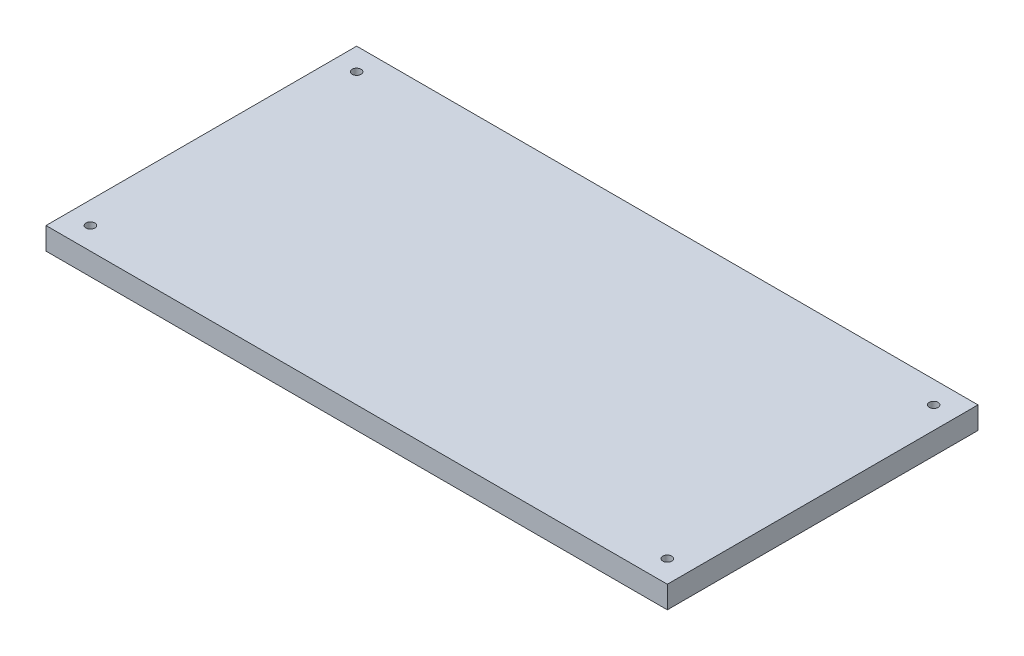
ISO-10303-21;
HEADER;
FILE_DESCRIPTION(('STEP AP214'),'2;1');
FILE_NAME('part.step','',(''),(''),'','','');
FILE_SCHEMA(('AUTOMOTIVE_DESIGN { 1 0 10303 214 1 1 1 1 }'));
ENDSEC;
DATA;
#1=APPLICATION_CONTEXT('core data for automotive mechanical design processes');
#2=APPLICATION_PROTOCOL_DEFINITION('international standard','automotive_design',2000,#1);
#3=PRODUCT_CONTEXT('',#1,'mechanical');
#4=PRODUCT('Part','Part','',(#3));
#5=PRODUCT_RELATED_PRODUCT_CATEGORY('part','',(#4));
#6=PRODUCT_DEFINITION_FORMATION('','',#4);
#7=PRODUCT_DEFINITION_CONTEXT('part definition',#1,'design');
#8=PRODUCT_DEFINITION('design','',#6,#7);
#9=PRODUCT_DEFINITION_SHAPE('','',#8);
#10=(LENGTH_UNIT() NAMED_UNIT(*) SI_UNIT(.MILLI.,.METRE.));
#11=(NAMED_UNIT(*) PLANE_ANGLE_UNIT() SI_UNIT($,.RADIAN.));
#12=(NAMED_UNIT(*) SI_UNIT($,.STERADIAN.) SOLID_ANGLE_UNIT());
#13=UNCERTAINTY_MEASURE_WITH_UNIT(LENGTH_MEASURE(1.E-05),#10,'distance_accuracy_value','');
#14=(GEOMETRIC_REPRESENTATION_CONTEXT(3) GLOBAL_UNCERTAINTY_ASSIGNED_CONTEXT((#13)) GLOBAL_UNIT_ASSIGNED_CONTEXT((#10,
#11,#12)) REPRESENTATION_CONTEXT('',''));
#15=CARTESIAN_POINT('',(0.,0.,0.));
#16=DIRECTION('',(0.,0.,1.));
#17=DIRECTION('',(1.,0.,0.));
#18=AXIS2_PLACEMENT_3D('',#15,#16,#17);
#19=CARTESIAN_POINT('',(0.,5.,0.));
#20=DIRECTION('',(0.,1.,0.));
#21=DIRECTION('',(0.,0.,1.));
#22=AXIS2_PLACEMENT_3D('',#19,#20,#21);
#23=PLANE('',#22);
#24=CARTESIAN_POINT('',(5.,5.,5.00000000000003));
#25=DIRECTION('',(0.,1.,0.));
#26=DIRECTION('',(0.,0.,1.));
#27=AXIS2_PLACEMENT_3D('',#24,#25,#26);
#28=CIRCLE('',#27,0.999999999999998);
#29=CARTESIAN_POINT('',(5.,5.,6.00000000000003));
#30=VERTEX_POINT('',#29);
#31=EDGE_CURVE('E148',#30,#30,#28,.T.);
#32=ORIENTED_EDGE('',*,*,#31,.F.);
#33=EDGE_LOOP('',(#32));
#34=FACE_BOUND('',#33,.T.);
#35=CARTESIAN_POINT('',(135.,5.,65.));
#36=DIRECTION('',(0.,1.,0.));
#37=DIRECTION('',(0.,0.,1.));
#38=AXIS2_PLACEMENT_3D('',#35,#36,#37);
#39=CIRCLE('',#38,0.999999999999998);
#40=CARTESIAN_POINT('',(135.,5.,66.));
#41=VERTEX_POINT('',#40);
#42=EDGE_CURVE('E118',#41,#41,#39,.T.);
#43=ORIENTED_EDGE('',*,*,#42,.F.);
#44=EDGE_LOOP('',(#43));
#45=FACE_BOUND('',#44,.T.);
#46=DIRECTION('',(0.,0.,1.));
#47=VECTOR('',#46,1.);
#48=CARTESIAN_POINT('',(0.,5.,0.));
#49=LINE('',#48,#47);
#50=CARTESIAN_POINT('',(0.,5.,0.));
#51=VERTEX_POINT('',#50);
#52=CARTESIAN_POINT('',(0.,5.,70.));
#53=VERTEX_POINT('',#52);
#54=EDGE_CURVE('E98',#51,#53,#49,.T.);
#55=ORIENTED_EDGE('',*,*,#54,.T.);
#56=DIRECTION('',(1.,0.,0.));
#57=VECTOR('',#56,1.);
#58=CARTESIAN_POINT('',(0.,5.,70.));
#59=LINE('',#58,#57);
#60=CARTESIAN_POINT('',(140.,5.,70.));
#61=VERTEX_POINT('',#60);
#62=EDGE_CURVE('E93',#53,#61,#59,.T.);
#63=ORIENTED_EDGE('',*,*,#62,.T.);
#64=DIRECTION('',(0.,0.,-1.));
#65=VECTOR('',#64,1.);
#66=CARTESIAN_POINT('',(140.,5.,0.));
#67=LINE('',#66,#65);
#68=CARTESIAN_POINT('',(140.,5.,0.));
#69=VERTEX_POINT('',#68);
#70=EDGE_CURVE('E96',#61,#69,#67,.T.);
#71=ORIENTED_EDGE('',*,*,#70,.T.);
#72=DIRECTION('',(-1.,0.,0.));
#73=VECTOR('',#72,1.);
#74=CARTESIAN_POINT('',(0.,5.,0.));
#75=LINE('',#74,#73);
#76=EDGE_CURVE('E63',#69,#51,#75,.T.);
#77=ORIENTED_EDGE('',*,*,#76,.T.);
#78=EDGE_LOOP('',(#55,#63,#71,#77));
#79=FACE_BOUND('',#78,.T.);
#80=CARTESIAN_POINT('',(135.,5.,5.));
#81=DIRECTION('',(0.,1.,0.));
#82=DIRECTION('',(0.,0.,-1.));
#83=AXIS2_PLACEMENT_3D('',#80,#81,#82);
#84=CIRCLE('',#83,0.999999999999998);
#85=CARTESIAN_POINT('',(135.,5.,4.00000000000001));
#86=VERTEX_POINT('',#85);
#87=EDGE_CURVE('E140',#86,#86,#84,.T.);
#88=ORIENTED_EDGE('',*,*,#87,.F.);
#89=EDGE_LOOP('',(#88));
#90=FACE_BOUND('',#89,.T.);
#91=CARTESIAN_POINT('',(5.00000000000003,5.,65.));
#92=DIRECTION('',(0.,1.,0.));
#93=DIRECTION('',(0.,0.,-1.));
#94=AXIS2_PLACEMENT_3D('',#91,#92,#93);
#95=CIRCLE('',#94,0.999999999999998);
#96=CARTESIAN_POINT('',(5.00000000000003,5.,64.));
#97=VERTEX_POINT('',#96);
#98=EDGE_CURVE('E156',#97,#97,#95,.T.);
#99=ORIENTED_EDGE('',*,*,#98,.F.);
#100=EDGE_LOOP('',(#99));
#101=FACE_BOUND('',#100,.T.);
#102=ADVANCED_FACE('F45',(#34,#45,#79,#90,#101),#23,.T.);
#103=CARTESIAN_POINT('',(0.,0.,0.));
#104=DIRECTION('',(0.,1.,0.));
#105=DIRECTION('',(0.,0.,1.));
#106=AXIS2_PLACEMENT_3D('',#103,#104,#105);
#107=PLANE('',#106);
#108=DIRECTION('',(0.,0.,1.));
#109=VECTOR('',#108,1.);
#110=CARTESIAN_POINT('',(0.,0.,0.));
#111=LINE('',#110,#109);
#112=CARTESIAN_POINT('',(0.,0.,0.));
#113=VERTEX_POINT('',#112);
#114=CARTESIAN_POINT('',(0.,0.,70.));
#115=VERTEX_POINT('',#114);
#116=EDGE_CURVE('E114',#113,#115,#111,.T.);
#117=ORIENTED_EDGE('',*,*,#116,.F.);
#118=DIRECTION('',(-1.,0.,0.));
#119=VECTOR('',#118,1.);
#120=CARTESIAN_POINT('',(0.,0.,0.));
#121=LINE('',#120,#119);
#122=CARTESIAN_POINT('',(140.,0.,0.));
#123=VERTEX_POINT('',#122);
#124=EDGE_CURVE('E86',#123,#113,#121,.T.);
#125=ORIENTED_EDGE('',*,*,#124,.F.);
#126=DIRECTION('',(0.,0.,-1.));
#127=VECTOR('',#126,1.);
#128=CARTESIAN_POINT('',(140.,0.,0.));
#129=LINE('',#128,#127);
#130=CARTESIAN_POINT('',(140.,0.,70.));
#131=VERTEX_POINT('',#130);
#132=EDGE_CURVE('E80',#131,#123,#129,.T.);
#133=ORIENTED_EDGE('',*,*,#132,.F.);
#134=DIRECTION('',(1.,0.,0.));
#135=VECTOR('',#134,1.);
#136=CARTESIAN_POINT('',(0.,0.,70.));
#137=LINE('',#136,#135);
#138=EDGE_CURVE('E103',#115,#131,#137,.T.);
#139=ORIENTED_EDGE('',*,*,#138,.F.);
#140=EDGE_LOOP('',(#117,#125,#133,#139));
#141=FACE_BOUND('',#140,.T.);
#142=CARTESIAN_POINT('',(135.,0.,65.));
#143=DIRECTION('',(0.,1.,0.));
#144=DIRECTION('',(0.,0.,1.));
#145=AXIS2_PLACEMENT_3D('',#142,#143,#144);
#146=CIRCLE('',#145,0.999999999999998);
#147=CARTESIAN_POINT('',(135.,0.,66.));
#148=VERTEX_POINT('',#147);
#149=EDGE_CURVE('E136',#148,#148,#146,.T.);
#150=ORIENTED_EDGE('',*,*,#149,.T.);
#151=EDGE_LOOP('',(#150));
#152=FACE_BOUND('',#151,.T.);
#153=CARTESIAN_POINT('',(135.,0.,5.));
#154=DIRECTION('',(0.,1.,0.));
#155=DIRECTION('',(0.,0.,-1.));
#156=AXIS2_PLACEMENT_3D('',#153,#154,#155);
#157=CIRCLE('',#156,0.999999999999998);
#158=CARTESIAN_POINT('',(135.,0.,4.00000000000001));
#159=VERTEX_POINT('',#158);
#160=EDGE_CURVE('E144',#159,#159,#157,.T.);
#161=ORIENTED_EDGE('',*,*,#160,.T.);
#162=EDGE_LOOP('',(#161));
#163=FACE_BOUND('',#162,.T.);
#164=CARTESIAN_POINT('',(5.,0.,5.00000000000003));
#165=DIRECTION('',(0.,1.,0.));
#166=DIRECTION('',(0.,0.,1.));
#167=AXIS2_PLACEMENT_3D('',#164,#165,#166);
#168=CIRCLE('',#167,0.999999999999998);
#169=CARTESIAN_POINT('',(5.,0.,6.00000000000003));
#170=VERTEX_POINT('',#169);
#171=EDGE_CURVE('E152',#170,#170,#168,.T.);
#172=ORIENTED_EDGE('',*,*,#171,.T.);
#173=EDGE_LOOP('',(#172));
#174=FACE_BOUND('',#173,.T.);
#175=CARTESIAN_POINT('',(5.00000000000003,0.,65.));
#176=DIRECTION('',(0.,1.,0.));
#177=DIRECTION('',(0.,0.,-1.));
#178=AXIS2_PLACEMENT_3D('',#175,#176,#177);
#179=CIRCLE('',#178,0.999999999999998);
#180=CARTESIAN_POINT('',(5.00000000000003,0.,64.));
#181=VERTEX_POINT('',#180);
#182=EDGE_CURVE('E160',#181,#181,#179,.T.);
#183=ORIENTED_EDGE('',*,*,#182,.T.);
#184=EDGE_LOOP('',(#183));
#185=FACE_BOUND('',#184,.T.);
#186=ADVANCED_FACE('F131',(#141,#152,#163,#174,#185),#107,.F.);
#187=CARTESIAN_POINT('',(0.,5.,0.));
#188=DIRECTION('',(1.,0.,0.));
#189=DIRECTION('',(0.,0.,-1.));
#190=AXIS2_PLACEMENT_3D('',#187,#188,#189);
#191=PLANE('',#190);
#192=ORIENTED_EDGE('',*,*,#116,.T.);
#193=DIRECTION('',(0.,-1.,0.));
#194=VECTOR('',#193,1.);
#195=CARTESIAN_POINT('',(0.,5.,70.));
#196=LINE('',#195,#194);
#197=EDGE_CURVE('E11',#53,#115,#196,.T.);
#198=ORIENTED_EDGE('',*,*,#197,.F.);
#199=ORIENTED_EDGE('',*,*,#54,.F.);
#200=DIRECTION('',(0.,-1.,0.));
#201=VECTOR('',#200,1.);
#202=CARTESIAN_POINT('',(0.,5.,0.));
#203=LINE('',#202,#201);
#204=EDGE_CURVE('E110',#51,#113,#203,.T.);
#205=ORIENTED_EDGE('',*,*,#204,.T.);
#206=EDGE_LOOP('',(#192,#198,#199,#205));
#207=FACE_BOUND('',#206,.T.);
#208=ADVANCED_FACE('F47',(#207),#191,.F.);
#209=CARTESIAN_POINT('',(0.,5.,70.));
#210=DIRECTION('',(0.,0.,-1.));
#211=DIRECTION('',(-1.,0.,0.));
#212=AXIS2_PLACEMENT_3D('',#209,#210,#211);
#213=PLANE('',#212);
#214=ORIENTED_EDGE('',*,*,#138,.T.);
#215=DIRECTION('',(0.,-1.,0.));
#216=VECTOR('',#215,1.);
#217=CARTESIAN_POINT('',(140.,5.,70.));
#218=LINE('',#217,#216);
#219=EDGE_CURVE('E55',#61,#131,#218,.T.);
#220=ORIENTED_EDGE('',*,*,#219,.F.);
#221=ORIENTED_EDGE('',*,*,#62,.F.);
#222=ORIENTED_EDGE('',*,*,#197,.T.);
#223=EDGE_LOOP('',(#214,#220,#221,#222));
#224=FACE_BOUND('',#223,.T.);
#225=ADVANCED_FACE('F102',(#224),#213,.F.);
#226=CARTESIAN_POINT('',(140.,5.,0.));
#227=DIRECTION('',(-1.,0.,0.));
#228=DIRECTION('',(0.,0.,1.));
#229=AXIS2_PLACEMENT_3D('',#226,#227,#228);
#230=PLANE('',#229);
#231=ORIENTED_EDGE('',*,*,#132,.T.);
#232=DIRECTION('',(0.,-1.,0.));
#233=VECTOR('',#232,1.);
#234=CARTESIAN_POINT('',(140.,5.,0.));
#235=LINE('',#234,#233);
#236=EDGE_CURVE('E105',#69,#123,#235,.T.);
#237=ORIENTED_EDGE('',*,*,#236,.F.);
#238=ORIENTED_EDGE('',*,*,#70,.F.);
#239=ORIENTED_EDGE('',*,*,#219,.T.);
#240=EDGE_LOOP('',(#231,#237,#238,#239));
#241=FACE_BOUND('',#240,.T.);
#242=ADVANCED_FACE('F106',(#241),#230,.F.);
#243=CARTESIAN_POINT('',(0.,5.,0.));
#244=DIRECTION('',(0.,0.,1.));
#245=DIRECTION('',(1.,0.,0.));
#246=AXIS2_PLACEMENT_3D('',#243,#244,#245);
#247=PLANE('',#246);
#248=ORIENTED_EDGE('',*,*,#124,.T.);
#249=ORIENTED_EDGE('',*,*,#204,.F.);
#250=ORIENTED_EDGE('',*,*,#76,.F.);
#251=ORIENTED_EDGE('',*,*,#236,.T.);
#252=EDGE_LOOP('',(#248,#249,#250,#251));
#253=FACE_BOUND('',#252,.T.);
#254=ADVANCED_FACE('F128',(#253),#247,.F.);
#255=CARTESIAN_POINT('',(135.,5.,65.));
#256=DIRECTION('',(0.,-1.,0.));
#257=DIRECTION('',(0.,0.,-1.));
#258=AXIS2_PLACEMENT_3D('',#255,#256,#257);
#259=CYLINDRICAL_SURFACE('',#258,0.999999999999998);
#260=ORIENTED_EDGE('',*,*,#42,.T.);
#261=EDGE_LOOP('',(#260));
#262=FACE_BOUND('',#261,.T.);
#263=ORIENTED_EDGE('',*,*,#149,.F.);
#264=EDGE_LOOP('',(#263));
#265=FACE_BOUND('',#264,.T.);
#266=ADVANCED_FACE('F181',(#262,#265),#259,.F.);
#267=CARTESIAN_POINT('',(135.,5.,5.));
#268=DIRECTION('',(0.,-1.,0.));
#269=DIRECTION('',(0.,0.,-1.));
#270=AXIS2_PLACEMENT_3D('',#267,#268,#269);
#271=CYLINDRICAL_SURFACE('',#270,0.999999999999998);
#272=ORIENTED_EDGE('',*,*,#87,.T.);
#273=EDGE_LOOP('',(#272));
#274=FACE_BOUND('',#273,.T.);
#275=ORIENTED_EDGE('',*,*,#160,.F.);
#276=EDGE_LOOP('',(#275));
#277=FACE_BOUND('',#276,.T.);
#278=ADVANCED_FACE('F226',(#274,#277),#271,.F.);
#279=CARTESIAN_POINT('',(5.,5.,5.00000000000003));
#280=DIRECTION('',(0.,-1.,0.));
#281=DIRECTION('',(0.,0.,-1.));
#282=AXIS2_PLACEMENT_3D('',#279,#280,#281);
#283=CYLINDRICAL_SURFACE('',#282,0.999999999999998);
#284=ORIENTED_EDGE('',*,*,#31,.T.);
#285=EDGE_LOOP('',(#284));
#286=FACE_BOUND('',#285,.T.);
#287=ORIENTED_EDGE('',*,*,#171,.F.);
#288=EDGE_LOOP('',(#287));
#289=FACE_BOUND('',#288,.T.);
#290=ADVANCED_FACE('F234',(#286,#289),#283,.F.);
#291=CARTESIAN_POINT('',(5.00000000000003,5.,65.));
#292=DIRECTION('',(0.,-1.,0.));
#293=DIRECTION('',(0.,0.,-1.));
#294=AXIS2_PLACEMENT_3D('',#291,#292,#293);
#295=CYLINDRICAL_SURFACE('',#294,0.999999999999998);
#296=ORIENTED_EDGE('',*,*,#98,.T.);
#297=EDGE_LOOP('',(#296));
#298=FACE_BOUND('',#297,.T.);
#299=ORIENTED_EDGE('',*,*,#182,.F.);
#300=EDGE_LOOP('',(#299));
#301=FACE_BOUND('',#300,.T.);
#302=ADVANCED_FACE('F168',(#298,#301),#295,.F.);
#303=CLOSED_SHELL('',(#102,#186,#208,#225,#242,#254,#266,#278,#290,#302));
#304=MANIFOLD_SOLID_BREP('B2',#303);
#305=ADVANCED_BREP_SHAPE_REPRESENTATION('',(#18,#304),#14);
#306=SHAPE_DEFINITION_REPRESENTATION(#9,#305);
ENDSEC;
END-ISO-10303-21;
